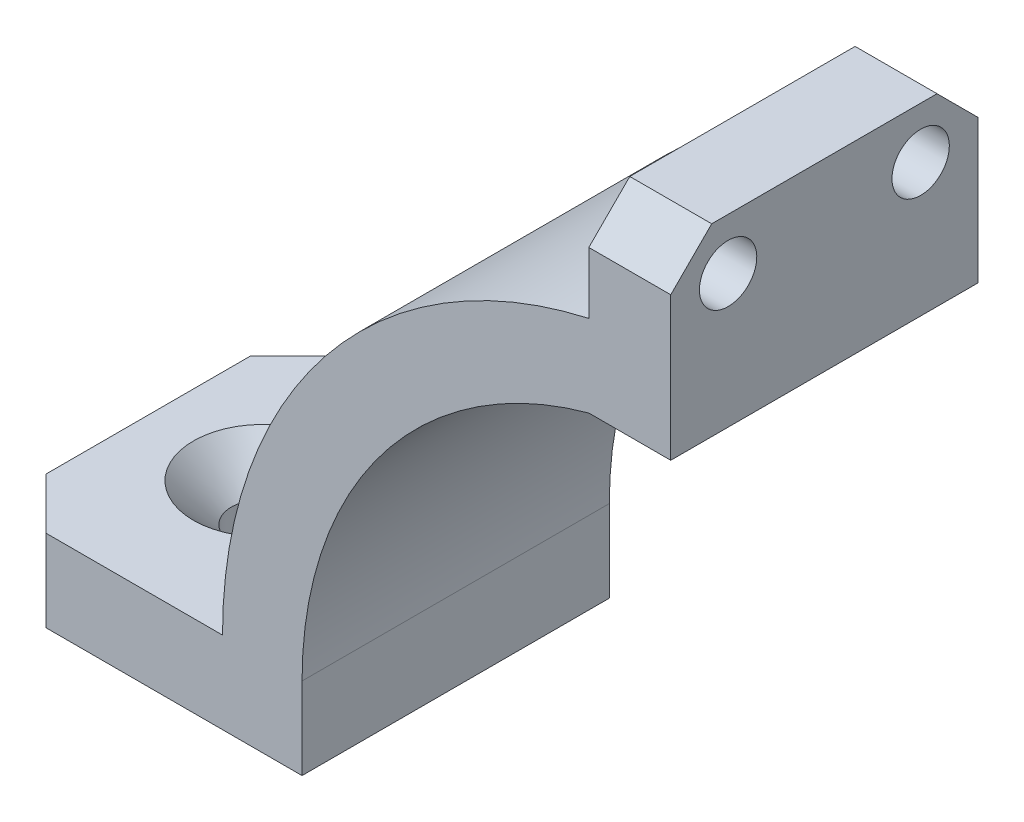
ISO-10303-21;
HEADER;
FILE_DESCRIPTION(('STEP AP214'),'2;1');
FILE_NAME('part.step','',(''),(''),'','','');
FILE_SCHEMA(('AUTOMOTIVE_DESIGN { 1 0 10303 214 1 1 1 1 }'));
ENDSEC;
DATA;
#1=APPLICATION_CONTEXT('core data for automotive mechanical design processes');
#2=APPLICATION_PROTOCOL_DEFINITION('international standard','automotive_design',2000,#1);
#3=PRODUCT_CONTEXT('',#1,'mechanical');
#4=PRODUCT('Part','Part','',(#3));
#5=PRODUCT_RELATED_PRODUCT_CATEGORY('part','',(#4));
#6=PRODUCT_DEFINITION_FORMATION('','',#4);
#7=PRODUCT_DEFINITION_CONTEXT('part definition',#1,'design');
#8=PRODUCT_DEFINITION('design','',#6,#7);
#9=PRODUCT_DEFINITION_SHAPE('','',#8);
#10=(LENGTH_UNIT() NAMED_UNIT(*) SI_UNIT(.MILLI.,.METRE.));
#11=(NAMED_UNIT(*) PLANE_ANGLE_UNIT() SI_UNIT($,.RADIAN.));
#12=(NAMED_UNIT(*) SI_UNIT($,.STERADIAN.) SOLID_ANGLE_UNIT());
#13=UNCERTAINTY_MEASURE_WITH_UNIT(LENGTH_MEASURE(1.E-05),#10,'distance_accuracy_value','');
#14=(GEOMETRIC_REPRESENTATION_CONTEXT(3) GLOBAL_UNCERTAINTY_ASSIGNED_CONTEXT((#13)) GLOBAL_UNIT_ASSIGNED_CONTEXT((#10,
#11,#12)) REPRESENTATION_CONTEXT('',''));
#15=CARTESIAN_POINT('',(0.,0.,0.));
#16=DIRECTION('',(0.,0.,1.));
#17=DIRECTION('',(1.,0.,0.));
#18=AXIS2_PLACEMENT_3D('',#15,#16,#17);
#19=CARTESIAN_POINT('',(0.,0.,15.));
#20=DIRECTION('',(0.,0.,-1.));
#21=DIRECTION('',(-1.,0.,0.));
#22=AXIS2_PLACEMENT_3D('',#19,#20,#21);
#23=CYLINDRICAL_SURFACE('',#22,19.);
#24=CARTESIAN_POINT('',(0.,0.,0.));
#25=DIRECTION('',(0.,0.,-1.));
#26=DIRECTION('',(-1.,0.,0.));
#27=AXIS2_PLACEMENT_3D('',#24,#25,#26);
#28=CIRCLE('',#27,19.);
#29=CARTESIAN_POINT('',(-19.,0.,0.));
#30=VERTEX_POINT('',#29);
#31=CARTESIAN_POINT('',(-5.,18.3303027798234,0.));
#32=VERTEX_POINT('',#31);
#33=EDGE_CURVE('E173',#30,#32,#28,.T.);
#34=ORIENTED_EDGE('',*,*,#33,.T.);
#35=DIRECTION('',(0.,0.,-1.));
#36=VECTOR('',#35,1.);
#37=CARTESIAN_POINT('',(-5.,18.3303027798234,15.));
#38=LINE('',#37,#36);
#39=CARTESIAN_POINT('',(-5.,18.3303027798234,15.));
#40=VERTEX_POINT('',#39);
#41=EDGE_CURVE('E153',#40,#32,#38,.T.);
#42=ORIENTED_EDGE('',*,*,#41,.F.);
#43=CARTESIAN_POINT('',(0.,0.,15.));
#44=DIRECTION('',(0.,0.,-1.));
#45=DIRECTION('',(-1.,0.,0.));
#46=AXIS2_PLACEMENT_3D('',#43,#44,#45);
#47=CIRCLE('',#46,19.);
#48=CARTESIAN_POINT('',(-19.,0.,15.));
#49=VERTEX_POINT('',#48);
#50=EDGE_CURVE('E161',#49,#40,#47,.T.);
#51=ORIENTED_EDGE('',*,*,#50,.F.);
#52=DIRECTION('',(0.,0.,-1.));
#53=VECTOR('',#52,1.);
#54=CARTESIAN_POINT('',(-19.,0.,15.));
#55=LINE('',#54,#53);
#56=EDGE_CURVE('E245',#49,#30,#55,.T.);
#57=ORIENTED_EDGE('',*,*,#56,.T.);
#58=EDGE_LOOP('',(#34,#42,#51,#57));
#59=FACE_BOUND('',#58,.T.);
#60=ADVANCED_FACE('F45',(#59),#23,.F.);
#61=CARTESIAN_POINT('',(-0.999999999999999,18.3303027798234,15.));
#62=DIRECTION('',(0.,1.,0.));
#63=DIRECTION('',(0.,0.,1.));
#64=AXIS2_PLACEMENT_3D('',#61,#62,#63);
#65=PLANE('',#64);
#66=DIRECTION('',(1.,0.,0.));
#67=VECTOR('',#66,1.);
#68=CARTESIAN_POINT('',(-0.999999999999999,18.3303027798234,0.));
#69=LINE('',#68,#67);
#70=CARTESIAN_POINT('',(-0.999999999999999,18.3303027798234,0.));
#71=VERTEX_POINT('',#70);
#72=EDGE_CURVE('E259',#32,#71,#69,.T.);
#73=ORIENTED_EDGE('',*,*,#72,.T.);
#74=DIRECTION('',(0.,0.,-1.));
#75=VECTOR('',#74,1.);
#76=CARTESIAN_POINT('',(-0.999999999999999,18.3303027798234,15.));
#77=LINE('',#76,#75);
#78=CARTESIAN_POINT('',(-0.999999999999999,18.3303027798234,15.));
#79=VERTEX_POINT('',#78);
#80=EDGE_CURVE('E156',#79,#71,#77,.T.);
#81=ORIENTED_EDGE('',*,*,#80,.F.);
#82=DIRECTION('',(1.,0.,0.));
#83=VECTOR('',#82,1.);
#84=CARTESIAN_POINT('',(-0.999999999999999,18.3303027798234,15.));
#85=LINE('',#84,#83);
#86=EDGE_CURVE('E149',#40,#79,#85,.T.);
#87=ORIENTED_EDGE('',*,*,#86,.F.);
#88=ORIENTED_EDGE('',*,*,#41,.T.);
#89=EDGE_LOOP('',(#73,#81,#87,#88));
#90=FACE_BOUND('',#89,.T.);
#91=ADVANCED_FACE('F151',(#90),#65,.F.);
#92=CARTESIAN_POINT('',(-1.,27.3303027798234,15.));
#93=DIRECTION('',(-1.,0.,0.));
#94=DIRECTION('',(0.,-1.,0.));
#95=AXIS2_PLACEMENT_3D('',#92,#93,#94);
#96=PLANE('',#95);
#97=CARTESIAN_POINT('',(-0.999999999999999,24.8303027798234,2.8));
#98=DIRECTION('',(-1.,0.,0.));
#99=DIRECTION('',(0.,-1.,0.));
#100=AXIS2_PLACEMENT_3D('',#97,#98,#99);
#101=CIRCLE('',#100,1.4);
#102=CARTESIAN_POINT('',(-0.999999999999999,23.4303027798234,2.8));
#103=VERTEX_POINT('',#102);
#104=EDGE_CURVE('E262',#103,#103,#101,.T.);
#105=ORIENTED_EDGE('',*,*,#104,.T.);
#106=EDGE_LOOP('',(#105));
#107=FACE_BOUND('',#106,.T.);
#108=CARTESIAN_POINT('',(-0.999999999999999,24.8303027798234,12.2));
#109=DIRECTION('',(-1.,0.,0.));
#110=DIRECTION('',(0.,-1.,0.));
#111=AXIS2_PLACEMENT_3D('',#108,#109,#110);
#112=CIRCLE('',#111,1.4);
#113=CARTESIAN_POINT('',(-0.999999999999999,23.4303027798234,12.2));
#114=VERTEX_POINT('',#113);
#115=EDGE_CURVE('E274',#114,#114,#112,.T.);
#116=ORIENTED_EDGE('',*,*,#115,.T.);
#117=EDGE_LOOP('',(#116));
#118=FACE_BOUND('',#117,.T.);
#119=DIRECTION('',(0.,0.,-1.));
#120=VECTOR('',#119,1.);
#121=CARTESIAN_POINT('',(-1.,27.3303027798234,15.));
#122=LINE('',#121,#120);
#123=CARTESIAN_POINT('',(-1.,27.3303027798234,13.));
#124=VERTEX_POINT('',#123);
#125=CARTESIAN_POINT('',(-1.,27.3303027798234,2.));
#126=VERTEX_POINT('',#125);
#127=EDGE_CURVE('E178',#124,#126,#122,.T.);
#128=ORIENTED_EDGE('',*,*,#127,.F.);
#129=DIRECTION('',(0.,0.707106781186546,-0.707106781186549));
#130=VECTOR('',#129,1.);
#131=CARTESIAN_POINT('',(-1.,25.3303027798234,15.));
#132=LINE('',#131,#130);
#133=CARTESIAN_POINT('',(-1.,25.3303027798234,15.));
#134=VERTEX_POINT('',#133);
#135=EDGE_CURVE('E55',#124,#134,#132,.F.);
#136=ORIENTED_EDGE('',*,*,#135,.T.);
#137=DIRECTION('',(0.,1.,0.));
#138=VECTOR('',#137,1.);
#139=CARTESIAN_POINT('',(-1.,27.3303027798234,15.));
#140=LINE('',#139,#138);
#141=EDGE_CURVE('E160',#79,#134,#140,.T.);
#142=ORIENTED_EDGE('',*,*,#141,.F.);
#143=ORIENTED_EDGE('',*,*,#80,.T.);
#144=DIRECTION('',(0.,1.,0.));
#145=VECTOR('',#144,1.);
#146=CARTESIAN_POINT('',(-1.,27.3303027798234,0.));
#147=LINE('',#146,#145);
#148=CARTESIAN_POINT('',(-1.,25.3303027798234,0.));
#149=VERTEX_POINT('',#148);
#150=EDGE_CURVE('E257',#71,#149,#147,.T.);
#151=ORIENTED_EDGE('',*,*,#150,.T.);
#152=DIRECTION('',(0.,0.707106781186549,0.707106781186546));
#153=VECTOR('',#152,1.);
#154=CARTESIAN_POINT('',(-1.,27.3303027798234,2.));
#155=LINE('',#154,#153);
#156=EDGE_CURVE('E67',#149,#126,#155,.T.);
#157=ORIENTED_EDGE('',*,*,#156,.T.);
#158=EDGE_LOOP('',(#128,#136,#142,#143,#151,#157));
#159=FACE_BOUND('',#158,.T.);
#160=ADVANCED_FACE('F211',(#107,#118,#159),#96,.F.);
#161=CARTESIAN_POINT('',(-5.,27.3303027798234,15.));
#162=DIRECTION('',(0.,-1.,0.));
#163=DIRECTION('',(0.,0.,-1.));
#164=AXIS2_PLACEMENT_3D('',#161,#162,#163);
#165=PLANE('',#164);
#166=DIRECTION('',(0.,0.,-1.));
#167=VECTOR('',#166,1.);
#168=CARTESIAN_POINT('',(-5.,27.3303027798234,15.));
#169=LINE('',#168,#167);
#170=CARTESIAN_POINT('',(-5.,27.3303027798234,13.));
#171=VERTEX_POINT('',#170);
#172=CARTESIAN_POINT('',(-5.,27.3303027798234,2.));
#173=VERTEX_POINT('',#172);
#174=EDGE_CURVE('E223',#171,#173,#169,.T.);
#175=ORIENTED_EDGE('',*,*,#174,.F.);
#176=DIRECTION('',(1.,0.,0.));
#177=VECTOR('',#176,1.);
#178=CARTESIAN_POINT('',(-5.,27.3303027798234,13.));
#179=LINE('',#178,#177);
#180=EDGE_CURVE('E207',#171,#124,#179,.T.);
#181=ORIENTED_EDGE('',*,*,#180,.T.);
#182=ORIENTED_EDGE('',*,*,#127,.T.);
#183=DIRECTION('',(-1.,0.,0.));
#184=VECTOR('',#183,1.);
#185=CARTESIAN_POINT('',(-5.,27.3303027798234,2.));
#186=LINE('',#185,#184);
#187=EDGE_CURVE('E204',#126,#173,#186,.T.);
#188=ORIENTED_EDGE('',*,*,#187,.T.);
#189=EDGE_LOOP('',(#175,#181,#182,#188));
#190=FACE_BOUND('',#189,.T.);
#191=ADVANCED_FACE('F226',(#190),#165,.F.);
#192=CARTESIAN_POINT('',(-5.,22.3303027798234,15.));
#193=DIRECTION('',(1.,0.,0.));
#194=DIRECTION('',(0.,1.,0.));
#195=AXIS2_PLACEMENT_3D('',#192,#193,#194);
#196=PLANE('',#195);
#197=CARTESIAN_POINT('',(-5.,24.8303027798234,2.8));
#198=DIRECTION('',(-1.,0.,0.));
#199=DIRECTION('',(0.,-1.,0.));
#200=AXIS2_PLACEMENT_3D('',#197,#198,#199);
#201=CIRCLE('',#200,1.4);
#202=CARTESIAN_POINT('',(-5.,23.4303027798234,2.8));
#203=VERTEX_POINT('',#202);
#204=EDGE_CURVE('E277',#203,#203,#201,.T.);
#205=ORIENTED_EDGE('',*,*,#204,.F.);
#206=EDGE_LOOP('',(#205));
#207=FACE_BOUND('',#206,.T.);
#208=CARTESIAN_POINT('',(-5.,24.8303027798234,12.2));
#209=DIRECTION('',(-1.,0.,0.));
#210=DIRECTION('',(0.,-1.,0.));
#211=AXIS2_PLACEMENT_3D('',#208,#209,#210);
#212=CIRCLE('',#211,1.4);
#213=CARTESIAN_POINT('',(-5.,23.4303027798234,12.2));
#214=VERTEX_POINT('',#213);
#215=EDGE_CURVE('E278',#214,#214,#212,.T.);
#216=ORIENTED_EDGE('',*,*,#215,.F.);
#217=EDGE_LOOP('',(#216));
#218=FACE_BOUND('',#217,.T.);
#219=DIRECTION('',(0.,-1.,0.));
#220=VECTOR('',#219,1.);
#221=CARTESIAN_POINT('',(-5.,22.3303027798234,15.));
#222=LINE('',#221,#220);
#223=CARTESIAN_POINT('',(-5.,25.3303027798234,15.));
#224=VERTEX_POINT('',#223);
#225=CARTESIAN_POINT('',(-5.,22.3303027798234,15.));
#226=VERTEX_POINT('',#225);
#227=EDGE_CURVE('E216',#224,#226,#222,.T.);
#228=ORIENTED_EDGE('',*,*,#227,.F.);
#229=DIRECTION('',(0.,-0.707106781186546,0.707106781186549));
#230=VECTOR('',#229,1.);
#231=CARTESIAN_POINT('',(-5.,25.3303027798234,15.));
#232=LINE('',#231,#230);
#233=EDGE_CURVE('E202',#224,#171,#232,.F.);
#234=ORIENTED_EDGE('',*,*,#233,.T.);
#235=ORIENTED_EDGE('',*,*,#174,.T.);
#236=DIRECTION('',(0.,-0.707106781186549,-0.707106781186546));
#237=VECTOR('',#236,1.);
#238=CARTESIAN_POINT('',(-5.,27.3303027798234,2.));
#239=LINE('',#238,#237);
#240=CARTESIAN_POINT('',(-5.,25.3303027798234,0.));
#241=VERTEX_POINT('',#240);
#242=EDGE_CURVE('E200',#173,#241,#239,.T.);
#243=ORIENTED_EDGE('',*,*,#242,.T.);
#244=DIRECTION('',(0.,-1.,0.));
#245=VECTOR('',#244,1.);
#246=CARTESIAN_POINT('',(-5.,22.3303027798234,0.));
#247=LINE('',#246,#245);
#248=CARTESIAN_POINT('',(-5.,22.3303027798234,0.));
#249=VERTEX_POINT('',#248);
#250=EDGE_CURVE('E255',#241,#249,#247,.T.);
#251=ORIENTED_EDGE('',*,*,#250,.T.);
#252=DIRECTION('',(0.,0.,-1.));
#253=VECTOR('',#252,1.);
#254=CARTESIAN_POINT('',(-5.,22.3303027798234,15.));
#255=LINE('',#254,#253);
#256=EDGE_CURVE('E228',#226,#249,#255,.T.);
#257=ORIENTED_EDGE('',*,*,#256,.F.);
#258=EDGE_LOOP('',(#228,#234,#235,#243,#251,#257));
#259=FACE_BOUND('',#258,.T.);
#260=ADVANCED_FACE('F222',(#207,#218,#259),#196,.F.);
#261=CARTESIAN_POINT('',(0.,0.,15.));
#262=DIRECTION('',(0.,0.,-1.));
#263=DIRECTION('',(-1.,0.,0.));
#264=AXIS2_PLACEMENT_3D('',#261,#262,#263);
#265=CYLINDRICAL_SURFACE('',#264,22.8832345230867);
#266=CARTESIAN_POINT('',(0.,0.,0.));
#267=DIRECTION('',(0.,0.,1.));
#268=DIRECTION('',(-1.,0.,0.));
#269=AXIS2_PLACEMENT_3D('',#266,#267,#268);
#270=CIRCLE('',#269,22.8832345230867);
#271=CARTESIAN_POINT('',(-22.8832345230867,0.,0.));
#272=VERTEX_POINT('',#271);
#273=EDGE_CURVE('E253',#249,#272,#270,.T.);
#274=ORIENTED_EDGE('',*,*,#273,.T.);
#275=DIRECTION('',(0.,0.,-1.));
#276=VECTOR('',#275,1.);
#277=CARTESIAN_POINT('',(-22.8832345230867,0.,15.));
#278=LINE('',#277,#276);
#279=CARTESIAN_POINT('',(-22.8832345230867,0.,15.));
#280=VERTEX_POINT('',#279);
#281=EDGE_CURVE('E231',#280,#272,#278,.T.);
#282=ORIENTED_EDGE('',*,*,#281,.F.);
#283=CARTESIAN_POINT('',(0.,0.,15.));
#284=DIRECTION('',(0.,0.,1.));
#285=DIRECTION('',(-1.,0.,0.));
#286=AXIS2_PLACEMENT_3D('',#283,#284,#285);
#287=CIRCLE('',#286,22.8832345230867);
#288=EDGE_CURVE('E269',#226,#280,#287,.T.);
#289=ORIENTED_EDGE('',*,*,#288,.F.);
#290=ORIENTED_EDGE('',*,*,#256,.T.);
#291=EDGE_LOOP('',(#274,#282,#289,#290));
#292=FACE_BOUND('',#291,.T.);
#293=ADVANCED_FACE('F296',(#292),#265,.T.);
#294=CARTESIAN_POINT('',(-34.,0.,15.));
#295=DIRECTION('',(0.,-1.,0.));
#296=DIRECTION('',(0.,0.,-1.));
#297=AXIS2_PLACEMENT_3D('',#294,#295,#296);
#298=PLANE('',#297);
#299=CARTESIAN_POINT('',(-28.4416172615434,0.,7.5));
#300=DIRECTION('',(0.,1.,0.));
#301=DIRECTION('',(0.,0.,1.));
#302=AXIS2_PLACEMENT_3D('',#299,#300,#301);
#303=CIRCLE('',#302,3.36);
#304=CARTESIAN_POINT('',(-28.4416172615434,0.,10.86));
#305=VERTEX_POINT('',#304);
#306=EDGE_CURVE('E286',#305,#305,#303,.T.);
#307=ORIENTED_EDGE('',*,*,#306,.F.);
#308=EDGE_LOOP('',(#307));
#309=FACE_BOUND('',#308,.T.);
#310=DIRECTION('',(-1.,0.,0.));
#311=VECTOR('',#310,1.);
#312=CARTESIAN_POINT('',(-34.,0.,0.));
#313=LINE('',#312,#311);
#314=CARTESIAN_POINT('',(-31.5,0.,0.));
#315=VERTEX_POINT('',#314);
#316=EDGE_CURVE('E250',#272,#315,#313,.T.);
#317=ORIENTED_EDGE('',*,*,#316,.T.);
#318=DIRECTION('',(-0.707106781186548,0.,0.707106781186548));
#319=VECTOR('',#318,1.);
#320=CARTESIAN_POINT('',(-34.,0.,2.50000000000001));
#321=LINE('',#320,#319);
#322=CARTESIAN_POINT('',(-34.,0.,2.50000000000001));
#323=VERTEX_POINT('',#322);
#324=EDGE_CURVE('E192',#315,#323,#321,.T.);
#325=ORIENTED_EDGE('',*,*,#324,.T.);
#326=DIRECTION('',(0.,0.,-1.));
#327=VECTOR('',#326,1.);
#328=CARTESIAN_POINT('',(-34.,0.,15.));
#329=LINE('',#328,#327);
#330=CARTESIAN_POINT('',(-34.,0.,12.5));
#331=VERTEX_POINT('',#330);
#332=EDGE_CURVE('E236',#331,#323,#329,.T.);
#333=ORIENTED_EDGE('',*,*,#332,.F.);
#334=DIRECTION('',(-0.707106781186549,0.,-0.707106781186547));
#335=VECTOR('',#334,1.);
#336=CARTESIAN_POINT('',(-31.5,0.,15.));
#337=LINE('',#336,#335);
#338=CARTESIAN_POINT('',(-31.5,0.,15.));
#339=VERTEX_POINT('',#338);
#340=EDGE_CURVE('E190',#331,#339,#337,.F.);
#341=ORIENTED_EDGE('',*,*,#340,.T.);
#342=DIRECTION('',(-1.,0.,0.));
#343=VECTOR('',#342,1.);
#344=CARTESIAN_POINT('',(-34.,0.,15.));
#345=LINE('',#344,#343);
#346=EDGE_CURVE('E266',#280,#339,#345,.T.);
#347=ORIENTED_EDGE('',*,*,#346,.F.);
#348=ORIENTED_EDGE('',*,*,#281,.T.);
#349=EDGE_LOOP('',(#317,#325,#333,#341,#347,#348));
#350=FACE_BOUND('',#349,.T.);
#351=ADVANCED_FACE('F292',(#309,#350),#298,.F.);
#352=CARTESIAN_POINT('',(-34.,-4.,15.));
#353=DIRECTION('',(1.,0.,0.));
#354=DIRECTION('',(0.,1.,0.));
#355=AXIS2_PLACEMENT_3D('',#352,#353,#354);
#356=PLANE('',#355);
#357=ORIENTED_EDGE('',*,*,#332,.T.);
#358=DIRECTION('',(0.,-1.,0.));
#359=VECTOR('',#358,1.);
#360=CARTESIAN_POINT('',(-34.,-4.,2.50000000000001));
#361=LINE('',#360,#359);
#362=CARTESIAN_POINT('',(-34.,-4.,2.50000000000001));
#363=VERTEX_POINT('',#362);
#364=EDGE_CURVE('E176',#323,#363,#361,.T.);
#365=ORIENTED_EDGE('',*,*,#364,.T.);
#366=DIRECTION('',(0.,0.,-1.));
#367=VECTOR('',#366,1.);
#368=CARTESIAN_POINT('',(-34.,-4.,15.));
#369=LINE('',#368,#367);
#370=CARTESIAN_POINT('',(-34.,-4.,12.5));
#371=VERTEX_POINT('',#370);
#372=EDGE_CURVE('E239',#371,#363,#369,.T.);
#373=ORIENTED_EDGE('',*,*,#372,.F.);
#374=DIRECTION('',(0.,1.,0.));
#375=VECTOR('',#374,1.);
#376=CARTESIAN_POINT('',(-34.,-4.,12.5));
#377=LINE('',#376,#375);
#378=EDGE_CURVE('E174',#371,#331,#377,.T.);
#379=ORIENTED_EDGE('',*,*,#378,.T.);
#380=EDGE_LOOP('',(#357,#365,#373,#379));
#381=FACE_BOUND('',#380,.T.);
#382=ADVANCED_FACE('F295',(#381),#356,.F.);
#383=CARTESIAN_POINT('',(-19.,-4.,15.));
#384=DIRECTION('',(0.,1.,0.));
#385=DIRECTION('',(-1.,0.,0.));
#386=AXIS2_PLACEMENT_3D('',#383,#384,#385);
#387=PLANE('',#386);
#388=CARTESIAN_POINT('',(-28.4416172615434,-4.,7.5));
#389=DIRECTION('',(0.,1.,0.));
#390=DIRECTION('',(-1.,0.,0.));
#391=AXIS2_PLACEMENT_3D('',#388,#389,#390);
#392=CIRCLE('',#391,1.49999999999999);
#393=CARTESIAN_POINT('',(-29.9416172615433,-4.,7.5));
#394=VERTEX_POINT('',#393);
#395=EDGE_CURVE('E50',#394,#394,#392,.T.);
#396=ORIENTED_EDGE('',*,*,#395,.T.);
#397=EDGE_LOOP('',(#396));
#398=FACE_BOUND('',#397,.T.);
#399=ORIENTED_EDGE('',*,*,#372,.T.);
#400=DIRECTION('',(0.707106781186548,0.,-0.707106781186548));
#401=VECTOR('',#400,1.);
#402=CARTESIAN_POINT('',(-34.,-4.,2.50000000000001));
#403=LINE('',#402,#401);
#404=CARTESIAN_POINT('',(-31.5,-4.,0.));
#405=VERTEX_POINT('',#404);
#406=EDGE_CURVE('E186',#363,#405,#403,.T.);
#407=ORIENTED_EDGE('',*,*,#406,.T.);
#408=DIRECTION('',(1.,0.,0.));
#409=VECTOR('',#408,1.);
#410=CARTESIAN_POINT('',(-19.,-4.,0.));
#411=LINE('',#410,#409);
#412=CARTESIAN_POINT('',(-19.,-4.,0.));
#413=VERTEX_POINT('',#412);
#414=EDGE_CURVE('E248',#405,#413,#411,.T.);
#415=ORIENTED_EDGE('',*,*,#414,.T.);
#416=DIRECTION('',(0.,0.,-1.));
#417=VECTOR('',#416,1.);
#418=CARTESIAN_POINT('',(-19.,-4.,15.));
#419=LINE('',#418,#417);
#420=CARTESIAN_POINT('',(-19.,-4.,15.));
#421=VERTEX_POINT('',#420);
#422=EDGE_CURVE('E242',#421,#413,#419,.T.);
#423=ORIENTED_EDGE('',*,*,#422,.F.);
#424=DIRECTION('',(1.,0.,0.));
#425=VECTOR('',#424,1.);
#426=CARTESIAN_POINT('',(-19.,-4.,15.));
#427=LINE('',#426,#425);
#428=CARTESIAN_POINT('',(-31.5,-4.,15.));
#429=VERTEX_POINT('',#428);
#430=EDGE_CURVE('E264',#429,#421,#427,.T.);
#431=ORIENTED_EDGE('',*,*,#430,.F.);
#432=DIRECTION('',(0.707106781186549,0.,0.707106781186547));
#433=VECTOR('',#432,1.);
#434=CARTESIAN_POINT('',(-31.5,-4.,15.));
#435=LINE('',#434,#433);
#436=EDGE_CURVE('E184',#429,#371,#435,.F.);
#437=ORIENTED_EDGE('',*,*,#436,.T.);
#438=EDGE_LOOP('',(#399,#407,#415,#423,#431,#437));
#439=FACE_BOUND('',#438,.T.);
#440=ADVANCED_FACE('F312',(#398,#439),#387,.F.);
#441=CARTESIAN_POINT('',(-19.,0.,15.));
#442=DIRECTION('',(-1.,0.,0.));
#443=DIRECTION('',(0.,-1.,0.));
#444=AXIS2_PLACEMENT_3D('',#441,#442,#443);
#445=PLANE('',#444);
#446=DIRECTION('',(0.,1.,0.));
#447=VECTOR('',#446,1.);
#448=CARTESIAN_POINT('',(-19.,0.,0.));
#449=LINE('',#448,#447);
#450=EDGE_CURVE('E170',#413,#30,#449,.T.);
#451=ORIENTED_EDGE('',*,*,#450,.T.);
#452=ORIENTED_EDGE('',*,*,#56,.F.);
#453=DIRECTION('',(0.,1.,0.));
#454=VECTOR('',#453,1.);
#455=CARTESIAN_POINT('',(-19.,0.,15.));
#456=LINE('',#455,#454);
#457=EDGE_CURVE('E166',#421,#49,#456,.T.);
#458=ORIENTED_EDGE('',*,*,#457,.F.);
#459=ORIENTED_EDGE('',*,*,#422,.T.);
#460=EDGE_LOOP('',(#451,#452,#458,#459));
#461=FACE_BOUND('',#460,.T.);
#462=ADVANCED_FACE('F370',(#461),#445,.F.);
#463=CARTESIAN_POINT('',(0.,0.,15.));
#464=DIRECTION('',(0.,0.,-1.));
#465=DIRECTION('',(-1.,0.,0.));
#466=AXIS2_PLACEMENT_3D('',#463,#464,#465);
#467=PLANE('',#466);
#468=ORIENTED_EDGE('',*,*,#141,.T.);
#469=DIRECTION('',(-1.,0.,0.));
#470=VECTOR('',#469,1.);
#471=CARTESIAN_POINT('',(0.,25.3303027798234,15.));
#472=LINE('',#471,#470);
#473=EDGE_CURVE('E197',#134,#224,#472,.T.);
#474=ORIENTED_EDGE('',*,*,#473,.T.);
#475=ORIENTED_EDGE('',*,*,#227,.T.);
#476=ORIENTED_EDGE('',*,*,#288,.T.);
#477=ORIENTED_EDGE('',*,*,#346,.T.);
#478=DIRECTION('',(0.,-1.,0.));
#479=VECTOR('',#478,1.);
#480=CARTESIAN_POINT('',(-31.5,0.,15.));
#481=LINE('',#480,#479);
#482=EDGE_CURVE('E194',#339,#429,#481,.T.);
#483=ORIENTED_EDGE('',*,*,#482,.T.);
#484=ORIENTED_EDGE('',*,*,#430,.T.);
#485=ORIENTED_EDGE('',*,*,#457,.T.);
#486=ORIENTED_EDGE('',*,*,#50,.T.);
#487=ORIENTED_EDGE('',*,*,#86,.T.);
#488=EDGE_LOOP('',(#468,#474,#475,#476,#477,#483,#484,#485,#486,#487));
#489=FACE_BOUND('',#488,.T.);
#490=ADVANCED_FACE('F164',(#489),#467,.F.);
#491=CARTESIAN_POINT('',(0.,0.,0.));
#492=DIRECTION('',(0.,0.,-1.));
#493=DIRECTION('',(-1.,0.,0.));
#494=AXIS2_PLACEMENT_3D('',#491,#492,#493);
#495=PLANE('',#494);
#496=ORIENTED_EDGE('',*,*,#250,.F.);
#497=DIRECTION('',(1.,0.,0.));
#498=VECTOR('',#497,1.);
#499=CARTESIAN_POINT('',(-1.,25.3303027798234,0.));
#500=LINE('',#499,#498);
#501=EDGE_CURVE('E11',#241,#149,#500,.T.);
#502=ORIENTED_EDGE('',*,*,#501,.T.);
#503=ORIENTED_EDGE('',*,*,#150,.F.);
#504=ORIENTED_EDGE('',*,*,#72,.F.);
#505=ORIENTED_EDGE('',*,*,#33,.F.);
#506=ORIENTED_EDGE('',*,*,#450,.F.);
#507=ORIENTED_EDGE('',*,*,#414,.F.);
#508=DIRECTION('',(0.,1.,0.));
#509=VECTOR('',#508,1.);
#510=CARTESIAN_POINT('',(-31.5,0.,0.));
#511=LINE('',#510,#509);
#512=EDGE_CURVE('E188',#405,#315,#511,.T.);
#513=ORIENTED_EDGE('',*,*,#512,.T.);
#514=ORIENTED_EDGE('',*,*,#316,.F.);
#515=ORIENTED_EDGE('',*,*,#273,.F.);
#516=EDGE_LOOP('',(#496,#502,#503,#504,#505,#506,#507,#513,#514,#515));
#517=FACE_BOUND('',#516,.T.);
#518=ADVANCED_FACE('F322',(#517),#495,.T.);
#519=CARTESIAN_POINT('',(-34.,-4.,2.50000000000001));
#520=DIRECTION('',(-0.707106781186547,0.,-0.707106781186547));
#521=DIRECTION('',(0.,1.,0.));
#522=AXIS2_PLACEMENT_3D('',#519,#520,#521);
#523=PLANE('',#522);
#524=ORIENTED_EDGE('',*,*,#324,.F.);
#525=ORIENTED_EDGE('',*,*,#512,.F.);
#526=ORIENTED_EDGE('',*,*,#406,.F.);
#527=ORIENTED_EDGE('',*,*,#364,.F.);
#528=EDGE_LOOP('',(#524,#525,#526,#527));
#529=FACE_BOUND('',#528,.T.);
#530=ADVANCED_FACE('F307',(#529),#523,.T.);
#531=CARTESIAN_POINT('',(-31.5,0.,15.));
#532=DIRECTION('',(0.707106781186547,0.,-0.707106781186549));
#533=DIRECTION('',(0.,-1.,0.));
#534=AXIS2_PLACEMENT_3D('',#531,#532,#533);
#535=PLANE('',#534);
#536=ORIENTED_EDGE('',*,*,#340,.F.);
#537=ORIENTED_EDGE('',*,*,#378,.F.);
#538=ORIENTED_EDGE('',*,*,#436,.F.);
#539=ORIENTED_EDGE('',*,*,#482,.F.);
#540=EDGE_LOOP('',(#536,#537,#538,#539));
#541=FACE_BOUND('',#540,.T.);
#542=ADVANCED_FACE('F319',(#541),#535,.F.);
#543=CARTESIAN_POINT('',(10.,24.8303027798234,12.2));
#544=DIRECTION('',(-1.,0.,0.));
#545=DIRECTION('',(0.,-1.,0.));
#546=AXIS2_PLACEMENT_3D('',#543,#544,#545);
#547=CYLINDRICAL_SURFACE('',#546,1.4);
#548=ORIENTED_EDGE('',*,*,#215,.T.);
#549=EDGE_LOOP('',(#548));
#550=FACE_BOUND('',#549,.T.);
#551=ORIENTED_EDGE('',*,*,#115,.F.);
#552=EDGE_LOOP('',(#551));
#553=FACE_BOUND('',#552,.T.);
#554=ADVANCED_FACE('F351',(#550,#553),#547,.F.);
#555=CARTESIAN_POINT('',(10.,24.8303027798234,2.8));
#556=DIRECTION('',(-1.,0.,0.));
#557=DIRECTION('',(0.,-1.,0.));
#558=AXIS2_PLACEMENT_3D('',#555,#556,#557);
#559=CYLINDRICAL_SURFACE('',#558,1.4);
#560=ORIENTED_EDGE('',*,*,#204,.T.);
#561=EDGE_LOOP('',(#560));
#562=FACE_BOUND('',#561,.T.);
#563=ORIENTED_EDGE('',*,*,#104,.F.);
#564=EDGE_LOOP('',(#563));
#565=FACE_BOUND('',#564,.T.);
#566=ADVANCED_FACE('F332',(#562,#565),#559,.F.);
#567=CARTESIAN_POINT('',(0.,25.3303027798234,15.));
#568=DIRECTION('',(0.,-0.707106781186549,-0.707106781186546));
#569=DIRECTION('',(-1.,0.,0.));
#570=AXIS2_PLACEMENT_3D('',#567,#568,#569);
#571=PLANE('',#570);
#572=ORIENTED_EDGE('',*,*,#135,.F.);
#573=ORIENTED_EDGE('',*,*,#180,.F.);
#574=ORIENTED_EDGE('',*,*,#233,.F.);
#575=ORIENTED_EDGE('',*,*,#473,.F.);
#576=EDGE_LOOP('',(#572,#573,#574,#575));
#577=FACE_BOUND('',#576,.T.);
#578=ADVANCED_FACE('F218',(#577),#571,.F.);
#579=CARTESIAN_POINT('',(-5.,27.3303027798234,2.));
#580=DIRECTION('',(0.,0.707106781186546,-0.707106781186549));
#581=DIRECTION('',(1.,0.,0.));
#582=AXIS2_PLACEMENT_3D('',#579,#580,#581);
#583=PLANE('',#582);
#584=ORIENTED_EDGE('',*,*,#156,.F.);
#585=ORIENTED_EDGE('',*,*,#501,.F.);
#586=ORIENTED_EDGE('',*,*,#242,.F.);
#587=ORIENTED_EDGE('',*,*,#187,.F.);
#588=EDGE_LOOP('',(#584,#585,#586,#587));
#589=FACE_BOUND('',#588,.T.);
#590=ADVANCED_FACE('F48',(#589),#583,.T.);
#591=CARTESIAN_POINT('',(-28.4416172615434,0.,7.5));
#592=DIRECTION('',(0.,1.,0.));
#593=DIRECTION('',(0.,0.,1.));
#594=AXIS2_PLACEMENT_3D('',#591,#592,#593);
#595=CYLINDRICAL_SURFACE('',#594,1.49999999999999);
#596=CARTESIAN_POINT('',(-28.4416172615434,-1.86,7.5));
#597=DIRECTION('',(0.,1.,0.));
#598=DIRECTION('',(0.,0.,1.));
#599=AXIS2_PLACEMENT_3D('',#596,#597,#598);
#600=CIRCLE('',#599,1.49999999999999);
#601=CARTESIAN_POINT('',(-28.4416172615434,-1.86,8.99999999999999));
#602=VERTEX_POINT('',#601);
#603=EDGE_CURVE('E283',#602,#602,#600,.T.);
#604=ORIENTED_EDGE('',*,*,#603,.T.);
#605=EDGE_LOOP('',(#604));
#606=FACE_BOUND('',#605,.T.);
#607=ORIENTED_EDGE('',*,*,#395,.F.);
#608=EDGE_LOOP('',(#607));
#609=FACE_BOUND('',#608,.T.);
#610=ADVANCED_FACE('F325',(#606,#609),#595,.F.);
#611=CARTESIAN_POINT('',(-28.4416172615434,0.,7.5));
#612=DIRECTION('',(0.,1.,0.));
#613=DIRECTION('',(0.,0.,1.));
#614=AXIS2_PLACEMENT_3D('',#611,#612,#613);
#615=CONICAL_SURFACE('',#614,3.36,0.785398163397451);
#616=ORIENTED_EDGE('',*,*,#603,.F.);
#617=EDGE_LOOP('',(#616));
#618=FACE_BOUND('',#617,.T.);
#619=ORIENTED_EDGE('',*,*,#306,.T.);
#620=EDGE_LOOP('',(#619));
#621=FACE_BOUND('',#620,.T.);
#622=ADVANCED_FACE('F290',(#618,#621),#615,.F.);
#623=CLOSED_SHELL('',(#60,#91,#160,#191,#260,#293,#351,#382,#440,#462,#490,#518,#530,#542,#554,
#566,#578,#590,#610,#622));
#624=MANIFOLD_SOLID_BREP('B2',#623);
#625=ADVANCED_BREP_SHAPE_REPRESENTATION('',(#18,#624),#14);
#626=SHAPE_DEFINITION_REPRESENTATION(#9,#625);
ENDSEC;
END-ISO-10303-21;
